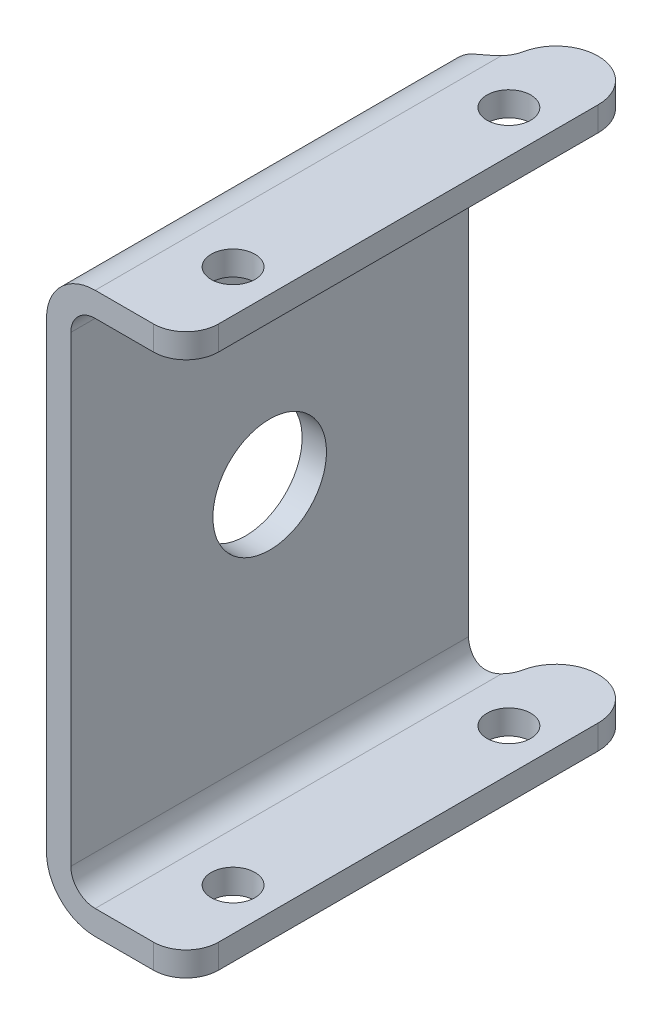
ISO-10303-21;
HEADER;
FILE_DESCRIPTION(('STEP AP214'),'2;1');
FILE_NAME('part.step','',(''),(''),'','','');
FILE_SCHEMA(('AUTOMOTIVE_DESIGN { 1 0 10303 214 1 1 1 1 }'));
ENDSEC;
DATA;
#1=APPLICATION_CONTEXT('core data for automotive mechanical design processes');
#2=APPLICATION_PROTOCOL_DEFINITION('international standard','automotive_design',2000,#1);
#3=PRODUCT_CONTEXT('',#1,'mechanical');
#4=PRODUCT('Part','Part','',(#3));
#5=PRODUCT_RELATED_PRODUCT_CATEGORY('part','',(#4));
#6=PRODUCT_DEFINITION_FORMATION('','',#4);
#7=PRODUCT_DEFINITION_CONTEXT('part definition',#1,'design');
#8=PRODUCT_DEFINITION('design','',#6,#7);
#9=PRODUCT_DEFINITION_SHAPE('','',#8);
#10=(LENGTH_UNIT() NAMED_UNIT(*) SI_UNIT(.MILLI.,.METRE.));
#11=(NAMED_UNIT(*) PLANE_ANGLE_UNIT() SI_UNIT($,.RADIAN.));
#12=(NAMED_UNIT(*) SI_UNIT($,.STERADIAN.) SOLID_ANGLE_UNIT());
#13=UNCERTAINTY_MEASURE_WITH_UNIT(LENGTH_MEASURE(1.E-05),#10,'distance_accuracy_value','');
#14=(GEOMETRIC_REPRESENTATION_CONTEXT(3) GLOBAL_UNCERTAINTY_ASSIGNED_CONTEXT((#13)) GLOBAL_UNIT_ASSIGNED_CONTEXT((#10,
#11,#12)) REPRESENTATION_CONTEXT('',''));
#15=CARTESIAN_POINT('',(0.,0.,0.));
#16=DIRECTION('',(0.,0.,1.));
#17=DIRECTION('',(1.,0.,0.));
#18=AXIS2_PLACEMENT_3D('',#15,#16,#17);
#19=CARTESIAN_POINT('',(8.6,0.,14.));
#20=DIRECTION('',(0.,1.,0.));
#21=DIRECTION('',(-1.,0.,0.));
#22=AXIS2_PLACEMENT_3D('',#19,#20,#21);
#23=PLANE('',#22);
#24=CARTESIAN_POINT('',(5.99999999999998,0.,8.5));
#25=DIRECTION('',(0.,1.,0.));
#26=DIRECTION('',(-1.,0.,0.));
#27=AXIS2_PLACEMENT_3D('',#24,#25,#26);
#28=CIRCLE('',#27,1.35);
#29=CARTESIAN_POINT('',(4.64999999999998,0.,8.5));
#30=VERTEX_POINT('',#29);
#31=EDGE_CURVE('E205',#30,#30,#28,.T.);
#32=ORIENTED_EDGE('',*,*,#31,.T.);
#33=EDGE_LOOP('',(#32));
#34=FACE_BOUND('',#33,.T.);
#35=CARTESIAN_POINT('',(5.99999999999998,0.,-8.5));
#36=DIRECTION('',(0.,1.,0.));
#37=DIRECTION('',(-1.,0.,0.));
#38=AXIS2_PLACEMENT_3D('',#35,#36,#37);
#39=CIRCLE('',#38,1.35);
#40=CARTESIAN_POINT('',(4.64999999999998,0.,-8.5));
#41=VERTEX_POINT('',#40);
#42=EDGE_CURVE('E217',#41,#41,#39,.T.);
#43=ORIENTED_EDGE('',*,*,#42,.T.);
#44=EDGE_LOOP('',(#43));
#45=FACE_BOUND('',#44,.T.);
#46=DIRECTION('',(0.,0.,-1.));
#47=VECTOR('',#46,1.);
#48=CARTESIAN_POINT('',(8.6,0.,14.));
#49=LINE('',#48,#47);
#50=CARTESIAN_POINT('',(8.6,0.,12.));
#51=VERTEX_POINT('',#50);
#52=CARTESIAN_POINT('',(8.6,0.,-11.4));
#53=VERTEX_POINT('',#52);
#54=EDGE_CURVE('E250',#51,#53,#49,.T.);
#55=ORIENTED_EDGE('',*,*,#54,.F.);
#56=CARTESIAN_POINT('',(6.6,0.,12.));
#57=DIRECTION('',(0.,1.,0.));
#58=DIRECTION('',(-1.,0.,0.));
#59=AXIS2_PLACEMENT_3D('',#56,#57,#58);
#60=CIRCLE('',#59,2.);
#61=CARTESIAN_POINT('',(6.6,0.,14.));
#62=VERTEX_POINT('',#61);
#63=EDGE_CURVE('E395',#51,#62,#60,.F.);
#64=ORIENTED_EDGE('',*,*,#63,.T.);
#65=DIRECTION('',(1.,0.,0.));
#66=VECTOR('',#65,1.);
#67=CARTESIAN_POINT('',(8.6,0.,14.));
#68=LINE('',#67,#66);
#69=CARTESIAN_POINT('',(3.,0.,14.));
#70=VERTEX_POINT('',#69);
#71=EDGE_CURVE('E228',#70,#62,#68,.T.);
#72=ORIENTED_EDGE('',*,*,#71,.F.);
#73=DIRECTION('',(0.,0.,-1.));
#74=VECTOR('',#73,1.);
#75=CARTESIAN_POINT('',(3.,0.,14.));
#76=LINE('',#75,#74);
#77=CARTESIAN_POINT('',(3.,0.,-11.0504724351967));
#78=VERTEX_POINT('',#77);
#79=EDGE_CURVE('E164',#70,#78,#76,.T.);
#80=ORIENTED_EDGE('',*,*,#79,.T.);
#81=CARTESIAN_POINT('',(1.74272766597048,0.,-12.2572723340295));
#82=DIRECTION('',(0.,1.,0.));
#83=DIRECTION('',(0.,0.,1.));
#84=AXIS2_PLACEMENT_3D('',#81,#82,#83);
#85=CIRCLE('',#84,1.74272766597048);
#86=CARTESIAN_POINT('',(3.4511622832782,0.,-11.9132507124364));
#87=VERTEX_POINT('',#86);
#88=EDGE_CURVE('E158',#78,#87,#85,.T.);
#89=ORIENTED_EDGE('',*,*,#88,.T.);
#90=CARTESIAN_POINT('',(5.99999999999999,0.,-11.4));
#91=DIRECTION('',(0.,1.,0.));
#92=DIRECTION('',(0.,0.,1.));
#93=AXIS2_PLACEMENT_3D('',#90,#91,#92);
#94=CIRCLE('',#93,2.60000000000001);
#95=EDGE_CURVE('E161',#53,#87,#94,.T.);
#96=ORIENTED_EDGE('',*,*,#95,.F.);
#97=EDGE_LOOP('',(#55,#64,#72,#80,#89,#96));
#98=FACE_BOUND('',#97,.T.);
#99=ADVANCED_FACE('F32',(#34,#45,#98),#23,.F.);
#100=CARTESIAN_POINT('',(1.5,1.5,14.));
#101=DIRECTION('',(0.,-1.,0.));
#102=DIRECTION('',(0.,0.,-1.));
#103=AXIS2_PLACEMENT_3D('',#100,#101,#102);
#104=PLANE('',#103);
#105=CARTESIAN_POINT('',(5.99999999999998,1.5,8.5));
#106=DIRECTION('',(0.,-1.,0.));
#107=DIRECTION('',(0.,0.,-1.));
#108=AXIS2_PLACEMENT_3D('',#105,#106,#107);
#109=CIRCLE('',#108,1.35);
#110=CARTESIAN_POINT('',(5.99999999999998,1.5,7.15));
#111=VERTEX_POINT('',#110);
#112=EDGE_CURVE('E213',#111,#111,#109,.T.);
#113=ORIENTED_EDGE('',*,*,#112,.T.);
#114=EDGE_LOOP('',(#113));
#115=FACE_BOUND('',#114,.T.);
#116=CARTESIAN_POINT('',(5.99999999999998,1.5,-8.5));
#117=DIRECTION('',(0.,-1.,0.));
#118=DIRECTION('',(0.,0.,-1.));
#119=AXIS2_PLACEMENT_3D('',#116,#117,#118);
#120=CIRCLE('',#119,1.35);
#121=CARTESIAN_POINT('',(5.99999999999998,1.5,-9.85));
#122=VERTEX_POINT('',#121);
#123=EDGE_CURVE('E225',#122,#122,#120,.T.);
#124=ORIENTED_EDGE('',*,*,#123,.T.);
#125=EDGE_LOOP('',(#124));
#126=FACE_BOUND('',#125,.T.);
#127=CARTESIAN_POINT('',(1.74272766597048,1.5,-12.2572723340295));
#128=DIRECTION('',(0.,-1.,0.));
#129=DIRECTION('',(0.,0.,-1.));
#130=AXIS2_PLACEMENT_3D('',#127,#128,#129);
#131=CIRCLE('',#130,1.74272766597048);
#132=CARTESIAN_POINT('',(3.4511622832782,1.5,-11.9132507124364));
#133=VERTEX_POINT('',#132);
#134=CARTESIAN_POINT('',(3.,1.5,-11.0504724351967));
#135=VERTEX_POINT('',#134);
#136=EDGE_CURVE('E181',#133,#135,#131,.T.);
#137=ORIENTED_EDGE('',*,*,#136,.T.);
#138=DIRECTION('',(0.,0.,-1.));
#139=VECTOR('',#138,1.);
#140=CARTESIAN_POINT('',(3.,1.5,14.));
#141=LINE('',#140,#139);
#142=CARTESIAN_POINT('',(3.,1.5,14.));
#143=VERTEX_POINT('',#142);
#144=EDGE_CURVE('E375',#135,#143,#141,.F.);
#145=ORIENTED_EDGE('',*,*,#144,.T.);
#146=DIRECTION('',(-1.,0.,0.));
#147=VECTOR('',#146,1.);
#148=CARTESIAN_POINT('',(1.5,1.5,14.));
#149=LINE('',#148,#147);
#150=CARTESIAN_POINT('',(6.6,1.5,14.));
#151=VERTEX_POINT('',#150);
#152=EDGE_CURVE('E231',#151,#143,#149,.T.);
#153=ORIENTED_EDGE('',*,*,#152,.F.);
#154=CARTESIAN_POINT('',(6.6,1.5,12.));
#155=DIRECTION('',(0.,-1.,0.));
#156=DIRECTION('',(0.,0.,-1.));
#157=AXIS2_PLACEMENT_3D('',#154,#155,#156);
#158=CIRCLE('',#157,2.);
#159=CARTESIAN_POINT('',(8.6,1.5,12.));
#160=VERTEX_POINT('',#159);
#161=EDGE_CURVE('E399',#151,#160,#158,.F.);
#162=ORIENTED_EDGE('',*,*,#161,.T.);
#163=DIRECTION('',(0.,0.,-1.));
#164=VECTOR('',#163,1.);
#165=CARTESIAN_POINT('',(8.6,1.5,14.));
#166=LINE('',#165,#164);
#167=CARTESIAN_POINT('',(8.6,1.5,-11.4));
#168=VERTEX_POINT('',#167);
#169=EDGE_CURVE('E248',#160,#168,#166,.T.);
#170=ORIENTED_EDGE('',*,*,#169,.T.);
#171=CARTESIAN_POINT('',(5.99999999999999,1.5,-11.4));
#172=DIRECTION('',(0.,-1.,0.));
#173=DIRECTION('',(0.,0.,-1.));
#174=AXIS2_PLACEMENT_3D('',#171,#172,#173);
#175=CIRCLE('',#174,2.60000000000001);
#176=EDGE_CURVE('E197',#133,#168,#175,.T.);
#177=ORIENTED_EDGE('',*,*,#176,.F.);
#178=EDGE_LOOP('',(#137,#145,#153,#162,#170,#177));
#179=FACE_BOUND('',#178,.T.);
#180=ADVANCED_FACE('F319',(#115,#126,#179),#104,.F.);
#181=CARTESIAN_POINT('',(1.5,33.,14.));
#182=DIRECTION('',(-1.,0.,0.));
#183=DIRECTION('',(0.,-1.,0.));
#184=AXIS2_PLACEMENT_3D('',#181,#182,#183);
#185=PLANE('',#184);
#186=CARTESIAN_POINT('',(1.5,17.25,1.74272766597048));
#187=DIRECTION('',(-1.,0.,0.));
#188=DIRECTION('',(0.,-1.,0.));
#189=AXIS2_PLACEMENT_3D('',#186,#187,#188);
#190=CIRCLE('',#189,3.5);
#191=CARTESIAN_POINT('',(1.5,17.25,5.24272766597048));
#192=VERTEX_POINT('',#191);
#193=EDGE_CURVE('E455',#192,#192,#190,.T.);
#194=ORIENTED_EDGE('',*,*,#193,.T.);
#195=EDGE_LOOP('',(#194));
#196=FACE_BOUND('',#195,.T.);
#197=DIRECTION('',(0.,1.,0.));
#198=VECTOR('',#197,1.);
#199=CARTESIAN_POINT('',(1.5,33.,14.));
#200=LINE('',#199,#198);
#201=CARTESIAN_POINT('',(1.5,3.,14.));
#202=VERTEX_POINT('',#201);
#203=CARTESIAN_POINT('',(1.5,31.5,14.));
#204=VERTEX_POINT('',#203);
#205=EDGE_CURVE('E234',#202,#204,#200,.T.);
#206=ORIENTED_EDGE('',*,*,#205,.F.);
#207=DIRECTION('',(0.,0.,-1.));
#208=VECTOR('',#207,1.);
#209=CARTESIAN_POINT('',(1.5,3.,-10.514544668059));
#210=LINE('',#209,#208);
#211=CARTESIAN_POINT('',(1.5,3.,-10.514544668059));
#212=VERTEX_POINT('',#211);
#213=EDGE_CURVE('E380',#202,#212,#210,.T.);
#214=ORIENTED_EDGE('',*,*,#213,.T.);
#215=DIRECTION('',(0.,-1.,0.));
#216=VECTOR('',#215,1.);
#217=CARTESIAN_POINT('',(1.5,33.,-10.514544668059));
#218=LINE('',#217,#216);
#219=CARTESIAN_POINT('',(1.5,31.5,-10.514544668059));
#220=VERTEX_POINT('',#219);
#221=EDGE_CURVE('E196',#220,#212,#218,.T.);
#222=ORIENTED_EDGE('',*,*,#221,.F.);
#223=DIRECTION('',(0.,0.,-1.));
#224=VECTOR('',#223,1.);
#225=CARTESIAN_POINT('',(1.5,31.5,14.));
#226=LINE('',#225,#224);
#227=EDGE_CURVE('E384',#220,#204,#226,.F.);
#228=ORIENTED_EDGE('',*,*,#227,.T.);
#229=EDGE_LOOP('',(#206,#214,#222,#228));
#230=FACE_BOUND('',#229,.T.);
#231=ADVANCED_FACE('F324',(#196,#230),#185,.F.);
#232=CARTESIAN_POINT('',(8.6,33.,14.));
#233=DIRECTION('',(0.,1.,0.));
#234=DIRECTION('',(0.,0.,1.));
#235=AXIS2_PLACEMENT_3D('',#232,#233,#234);
#236=PLANE('',#235);
#237=CARTESIAN_POINT('',(5.99999999999999,33.,8.5));
#238=DIRECTION('',(0.,1.,0.));
#239=DIRECTION('',(0.,0.,1.));
#240=AXIS2_PLACEMENT_3D('',#237,#238,#239);
#241=CIRCLE('',#240,1.35);
#242=CARTESIAN_POINT('',(5.99999999999999,33.,9.85));
#243=VERTEX_POINT('',#242);
#244=EDGE_CURVE('E208',#243,#243,#241,.T.);
#245=ORIENTED_EDGE('',*,*,#244,.T.);
#246=EDGE_LOOP('',(#245));
#247=FACE_BOUND('',#246,.T.);
#248=CARTESIAN_POINT('',(5.99999999999999,33.,-8.5));
#249=DIRECTION('',(0.,1.,0.));
#250=DIRECTION('',(0.,0.,1.));
#251=AXIS2_PLACEMENT_3D('',#248,#249,#250);
#252=CIRCLE('',#251,1.35);
#253=CARTESIAN_POINT('',(5.99999999999999,33.,-7.15));
#254=VERTEX_POINT('',#253);
#255=EDGE_CURVE('E220',#254,#254,#252,.T.);
#256=ORIENTED_EDGE('',*,*,#255,.T.);
#257=EDGE_LOOP('',(#256));
#258=FACE_BOUND('',#257,.T.);
#259=DIRECTION('',(1.,0.,0.));
#260=VECTOR('',#259,1.);
#261=CARTESIAN_POINT('',(8.6,33.,14.));
#262=LINE('',#261,#260);
#263=CARTESIAN_POINT('',(3.,33.,14.));
#264=VERTEX_POINT('',#263);
#265=CARTESIAN_POINT('',(6.6,33.,14.));
#266=VERTEX_POINT('',#265);
#267=EDGE_CURVE('E237',#264,#266,#262,.T.);
#268=ORIENTED_EDGE('',*,*,#267,.F.);
#269=DIRECTION('',(0.,0.,-1.));
#270=VECTOR('',#269,1.);
#271=CARTESIAN_POINT('',(3.,33.,-10.514544668059));
#272=LINE('',#271,#270);
#273=CARTESIAN_POINT('',(3.,33.,-11.0504724351967));
#274=VERTEX_POINT('',#273);
#275=EDGE_CURVE('E379',#264,#274,#272,.T.);
#276=ORIENTED_EDGE('',*,*,#275,.T.);
#277=CARTESIAN_POINT('',(1.74272766597048,33.,-12.2572723340295));
#278=DIRECTION('',(0.,1.,0.));
#279=DIRECTION('',(0.,0.,1.));
#280=AXIS2_PLACEMENT_3D('',#277,#278,#279);
#281=CIRCLE('',#280,1.74272766597048);
#282=CARTESIAN_POINT('',(3.4511622832782,33.,-11.9132507124364));
#283=VERTEX_POINT('',#282);
#284=EDGE_CURVE('E201',#274,#283,#281,.T.);
#285=ORIENTED_EDGE('',*,*,#284,.T.);
#286=CARTESIAN_POINT('',(5.99999999999999,33.,-11.4));
#287=DIRECTION('',(0.,1.,0.));
#288=DIRECTION('',(0.,0.,1.));
#289=AXIS2_PLACEMENT_3D('',#286,#287,#288);
#290=CIRCLE('',#289,2.60000000000001);
#291=CARTESIAN_POINT('',(8.6,33.,-11.4));
#292=VERTEX_POINT('',#291);
#293=EDGE_CURVE('E193',#292,#283,#290,.T.);
#294=ORIENTED_EDGE('',*,*,#293,.F.);
#295=DIRECTION('',(0.,0.,-1.));
#296=VECTOR('',#295,1.);
#297=CARTESIAN_POINT('',(8.6,33.,14.));
#298=LINE('',#297,#296);
#299=CARTESIAN_POINT('',(8.6,33.,12.));
#300=VERTEX_POINT('',#299);
#301=EDGE_CURVE('E246',#300,#292,#298,.T.);
#302=ORIENTED_EDGE('',*,*,#301,.F.);
#303=CARTESIAN_POINT('',(6.6,33.,12.));
#304=DIRECTION('',(0.,1.,0.));
#305=DIRECTION('',(0.,0.,1.));
#306=AXIS2_PLACEMENT_3D('',#303,#304,#305);
#307=CIRCLE('',#306,2.);
#308=EDGE_CURVE('E388',#300,#266,#307,.F.);
#309=ORIENTED_EDGE('',*,*,#308,.T.);
#310=EDGE_LOOP('',(#268,#276,#285,#294,#302,#309));
#311=FACE_BOUND('',#310,.T.);
#312=ADVANCED_FACE('F337',(#247,#258,#311),#236,.F.);
#313=CARTESIAN_POINT('',(0.,34.5,14.));
#314=DIRECTION('',(0.,-1.,0.));
#315=DIRECTION('',(0.,0.,-1.));
#316=AXIS2_PLACEMENT_3D('',#313,#314,#315);
#317=PLANE('',#316);
#318=CARTESIAN_POINT('',(5.99999999999999,34.5,8.5));
#319=DIRECTION('',(0.,1.,0.));
#320=DIRECTION('',(-1.,0.,0.));
#321=AXIS2_PLACEMENT_3D('',#318,#319,#320);
#322=CIRCLE('',#321,1.35);
#323=CARTESIAN_POINT('',(4.64999999999999,34.5,8.5));
#324=VERTEX_POINT('',#323);
#325=EDGE_CURVE('E204',#324,#324,#322,.T.);
#326=ORIENTED_EDGE('',*,*,#325,.F.);
#327=EDGE_LOOP('',(#326));
#328=FACE_BOUND('',#327,.T.);
#329=CARTESIAN_POINT('',(5.99999999999999,34.5,-8.5));
#330=DIRECTION('',(0.,1.,0.));
#331=DIRECTION('',(-1.,0.,0.));
#332=AXIS2_PLACEMENT_3D('',#329,#330,#331);
#333=CIRCLE('',#332,1.35);
#334=CARTESIAN_POINT('',(4.64999999999999,34.5,-8.5));
#335=VERTEX_POINT('',#334);
#336=EDGE_CURVE('E216',#335,#335,#333,.T.);
#337=ORIENTED_EDGE('',*,*,#336,.F.);
#338=EDGE_LOOP('',(#337));
#339=FACE_BOUND('',#338,.T.);
#340=DIRECTION('',(-1.,0.,0.));
#341=VECTOR('',#340,1.);
#342=CARTESIAN_POINT('',(0.,34.5,14.));
#343=LINE('',#342,#341);
#344=CARTESIAN_POINT('',(6.6,34.5,14.));
#345=VERTEX_POINT('',#344);
#346=CARTESIAN_POINT('',(3.,34.5,14.));
#347=VERTEX_POINT('',#346);
#348=EDGE_CURVE('E239',#345,#347,#343,.T.);
#349=ORIENTED_EDGE('',*,*,#348,.F.);
#350=CARTESIAN_POINT('',(6.6,34.5,12.));
#351=DIRECTION('',(0.,-1.,0.));
#352=DIRECTION('',(0.,0.,-1.));
#353=AXIS2_PLACEMENT_3D('',#350,#351,#352);
#354=CIRCLE('',#353,2.);
#355=CARTESIAN_POINT('',(8.6,34.5,12.));
#356=VERTEX_POINT('',#355);
#357=EDGE_CURVE('E393',#345,#356,#354,.F.);
#358=ORIENTED_EDGE('',*,*,#357,.T.);
#359=DIRECTION('',(0.,0.,-1.));
#360=VECTOR('',#359,1.);
#361=CARTESIAN_POINT('',(8.6,34.5,14.));
#362=LINE('',#361,#360);
#363=CARTESIAN_POINT('',(8.6,34.5,-11.4));
#364=VERTEX_POINT('',#363);
#365=EDGE_CURVE('E244',#356,#364,#362,.T.);
#366=ORIENTED_EDGE('',*,*,#365,.T.);
#367=CARTESIAN_POINT('',(5.99999999999999,34.5,-11.4));
#368=DIRECTION('',(0.,1.,0.));
#369=DIRECTION('',(0.,0.,1.));
#370=AXIS2_PLACEMENT_3D('',#367,#368,#369);
#371=CIRCLE('',#370,2.60000000000001);
#372=CARTESIAN_POINT('',(3.4511622832782,34.5,-11.9132507124364));
#373=VERTEX_POINT('',#372);
#374=EDGE_CURVE('E166',#364,#373,#371,.T.);
#375=ORIENTED_EDGE('',*,*,#374,.T.);
#376=CARTESIAN_POINT('',(1.74272766597048,34.5,-12.2572723340295));
#377=DIRECTION('',(0.,1.,0.));
#378=DIRECTION('',(0.,0.,1.));
#379=AXIS2_PLACEMENT_3D('',#376,#377,#378);
#380=CIRCLE('',#379,1.74272766597048);
#381=CARTESIAN_POINT('',(3.,34.5,-11.0504724351967));
#382=VERTEX_POINT('',#381);
#383=EDGE_CURVE('E444',#382,#373,#380,.T.);
#384=ORIENTED_EDGE('',*,*,#383,.F.);
#385=DIRECTION('',(0.,0.,-1.));
#386=VECTOR('',#385,1.);
#387=CARTESIAN_POINT('',(3.,34.5,14.));
#388=LINE('',#387,#386);
#389=EDGE_CURVE('E406',#382,#347,#388,.F.);
#390=ORIENTED_EDGE('',*,*,#389,.T.);
#391=EDGE_LOOP('',(#349,#358,#366,#375,#384,#390));
#392=FACE_BOUND('',#391,.T.);
#393=ADVANCED_FACE('F341',(#328,#339,#392),#317,.F.);
#394=CARTESIAN_POINT('',(0.,0.,14.));
#395=DIRECTION('',(1.,0.,0.));
#396=DIRECTION('',(0.,0.,-1.));
#397=AXIS2_PLACEMENT_3D('',#394,#395,#396);
#398=PLANE('',#397);
#399=CARTESIAN_POINT('',(0.,17.25,1.74272766597048));
#400=DIRECTION('',(-1.,0.,0.));
#401=DIRECTION('',(0.,0.,1.));
#402=AXIS2_PLACEMENT_3D('',#399,#400,#401);
#403=CIRCLE('',#402,3.5);
#404=CARTESIAN_POINT('',(0.,17.25,5.24272766597048));
#405=VERTEX_POINT('',#404);
#406=EDGE_CURVE('E460',#405,#405,#403,.T.);
#407=ORIENTED_EDGE('',*,*,#406,.F.);
#408=EDGE_LOOP('',(#407));
#409=FACE_BOUND('',#408,.T.);
#410=DIRECTION('',(0.,1.,0.));
#411=VECTOR('',#410,1.);
#412=CARTESIAN_POINT('',(0.,0.,-10.514544668059));
#413=LINE('',#412,#411);
#414=CARTESIAN_POINT('',(0.,3.,-10.514544668059));
#415=VERTEX_POINT('',#414);
#416=CARTESIAN_POINT('',(0.,31.5,-10.514544668059));
#417=VERTEX_POINT('',#416);
#418=EDGE_CURVE('E177',#415,#417,#413,.T.);
#419=ORIENTED_EDGE('',*,*,#418,.F.);
#420=DIRECTION('',(0.,0.,-1.));
#421=VECTOR('',#420,1.);
#422=CARTESIAN_POINT('',(0.,3.,14.));
#423=LINE('',#422,#421);
#424=CARTESIAN_POINT('',(0.,3.,14.));
#425=VERTEX_POINT('',#424);
#426=EDGE_CURVE('E417',#415,#425,#423,.F.);
#427=ORIENTED_EDGE('',*,*,#426,.T.);
#428=DIRECTION('',(0.,-1.,0.));
#429=VECTOR('',#428,1.);
#430=CARTESIAN_POINT('',(0.,0.,14.));
#431=LINE('',#430,#429);
#432=CARTESIAN_POINT('',(0.,31.5,14.));
#433=VERTEX_POINT('',#432);
#434=EDGE_CURVE('E241',#433,#425,#431,.T.);
#435=ORIENTED_EDGE('',*,*,#434,.F.);
#436=DIRECTION('',(0.,0.,-1.));
#437=VECTOR('',#436,1.);
#438=CARTESIAN_POINT('',(0.,31.5,14.));
#439=LINE('',#438,#437);
#440=EDGE_CURVE('E421',#433,#417,#439,.T.);
#441=ORIENTED_EDGE('',*,*,#440,.T.);
#442=EDGE_LOOP('',(#419,#427,#435,#441));
#443=FACE_BOUND('',#442,.T.);
#444=ADVANCED_FACE('F332',(#409,#443),#398,.F.);
#445=CARTESIAN_POINT('',(8.6,1.5,14.));
#446=DIRECTION('',(-1.,0.,0.));
#447=DIRECTION('',(0.,0.,1.));
#448=AXIS2_PLACEMENT_3D('',#445,#446,#447);
#449=PLANE('',#448);
#450=ORIENTED_EDGE('',*,*,#169,.F.);
#451=DIRECTION('',(0.,1.,0.));
#452=VECTOR('',#451,1.);
#453=CARTESIAN_POINT('',(8.6,1.5,12.));
#454=LINE('',#453,#452);
#455=EDGE_CURVE('E397',#160,#51,#454,.F.);
#456=ORIENTED_EDGE('',*,*,#455,.T.);
#457=ORIENTED_EDGE('',*,*,#54,.T.);
#458=DIRECTION('',(0.,1.,0.));
#459=VECTOR('',#458,1.);
#460=CARTESIAN_POINT('',(8.6,0.,-11.4));
#461=LINE('',#460,#459);
#462=EDGE_CURVE('E176',#53,#168,#461,.T.);
#463=ORIENTED_EDGE('',*,*,#462,.T.);
#464=EDGE_LOOP('',(#450,#456,#457,#463));
#465=FACE_BOUND('',#464,.T.);
#466=ADVANCED_FACE('F329',(#465),#449,.F.);
#467=CARTESIAN_POINT('',(8.6,34.5,14.));
#468=DIRECTION('',(-1.,0.,0.));
#469=DIRECTION('',(0.,-1.,0.));
#470=AXIS2_PLACEMENT_3D('',#467,#468,#469);
#471=PLANE('',#470);
#472=ORIENTED_EDGE('',*,*,#365,.F.);
#473=DIRECTION('',(0.,1.,0.));
#474=VECTOR('',#473,1.);
#475=CARTESIAN_POINT('',(8.6,34.5,12.));
#476=LINE('',#475,#474);
#477=EDGE_CURVE('E391',#356,#300,#476,.F.);
#478=ORIENTED_EDGE('',*,*,#477,.T.);
#479=ORIENTED_EDGE('',*,*,#301,.T.);
#480=EDGE_CURVE('E182',#292,#364,#461,.T.);
#481=ORIENTED_EDGE('',*,*,#480,.T.);
#482=EDGE_LOOP('',(#472,#478,#479,#481));
#483=FACE_BOUND('',#482,.T.);
#484=ADVANCED_FACE('F331',(#483),#471,.F.);
#485=CARTESIAN_POINT('',(0.,0.,14.));
#486=DIRECTION('',(0.,0.,-1.));
#487=DIRECTION('',(-1.,0.,0.));
#488=AXIS2_PLACEMENT_3D('',#485,#486,#487);
#489=PLANE('',#488);
#490=ORIENTED_EDGE('',*,*,#71,.T.);
#491=DIRECTION('',(0.,1.,0.));
#492=VECTOR('',#491,1.);
#493=CARTESIAN_POINT('',(6.6,0.,14.));
#494=LINE('',#493,#492);
#495=EDGE_CURVE('E401',#62,#151,#494,.T.);
#496=ORIENTED_EDGE('',*,*,#495,.T.);
#497=ORIENTED_EDGE('',*,*,#152,.T.);
#498=CARTESIAN_POINT('',(3.,3.,14.));
#499=DIRECTION('',(0.,0.,-1.));
#500=DIRECTION('',(-1.,0.,0.));
#501=AXIS2_PLACEMENT_3D('',#498,#499,#500);
#502=CIRCLE('',#501,1.5);
#503=EDGE_CURVE('E293',#143,#202,#502,.T.);
#504=ORIENTED_EDGE('',*,*,#503,.T.);
#505=ORIENTED_EDGE('',*,*,#205,.T.);
#506=CARTESIAN_POINT('',(3.,31.5,14.));
#507=DIRECTION('',(0.,0.,-1.));
#508=DIRECTION('',(-1.,0.,0.));
#509=AXIS2_PLACEMENT_3D('',#506,#507,#508);
#510=CIRCLE('',#509,1.5);
#511=EDGE_CURVE('E11',#204,#264,#510,.T.);
#512=ORIENTED_EDGE('',*,*,#511,.T.);
#513=ORIENTED_EDGE('',*,*,#267,.T.);
#514=DIRECTION('',(0.,1.,0.));
#515=VECTOR('',#514,1.);
#516=CARTESIAN_POINT('',(6.60000000000004,0.,14.));
#517=LINE('',#516,#515);
#518=EDGE_CURVE('E404',#266,#345,#517,.T.);
#519=ORIENTED_EDGE('',*,*,#518,.T.);
#520=ORIENTED_EDGE('',*,*,#348,.T.);
#521=CARTESIAN_POINT('',(3.,31.5,14.));
#522=DIRECTION('',(0.,0.,-1.));
#523=DIRECTION('',(-1.,0.,0.));
#524=AXIS2_PLACEMENT_3D('',#521,#522,#523);
#525=CIRCLE('',#524,3.);
#526=EDGE_CURVE('E415',#347,#433,#525,.F.);
#527=ORIENTED_EDGE('',*,*,#526,.T.);
#528=ORIENTED_EDGE('',*,*,#434,.T.);
#529=CARTESIAN_POINT('',(3.,3.,14.));
#530=DIRECTION('',(0.,0.,-1.));
#531=DIRECTION('',(-1.,0.,0.));
#532=AXIS2_PLACEMENT_3D('',#529,#530,#531);
#533=CIRCLE('',#532,3.);
#534=EDGE_CURVE('E412',#425,#70,#533,.F.);
#535=ORIENTED_EDGE('',*,*,#534,.T.);
#536=EDGE_LOOP('',(#490,#496,#497,#504,#505,#512,#513,#519,#520,#527,#528,#535));
#537=FACE_BOUND('',#536,.T.);
#538=ADVANCED_FACE('F345',(#537),#489,.F.);
#539=CARTESIAN_POINT('',(5.99999999999998,0.,-8.5));
#540=DIRECTION('',(0.,1.,0.));
#541=DIRECTION('',(-1.,0.,0.));
#542=AXIS2_PLACEMENT_3D('',#539,#540,#541);
#543=CYLINDRICAL_SURFACE('',#542,1.35);
#544=ORIENTED_EDGE('',*,*,#336,.T.);
#545=EDGE_LOOP('',(#544));
#546=FACE_BOUND('',#545,.T.);
#547=ORIENTED_EDGE('',*,*,#255,.F.);
#548=EDGE_LOOP('',(#547));
#549=FACE_BOUND('',#548,.T.);
#550=ADVANCED_FACE('F355',(#546,#549),#543,.F.);
#551=ORIENTED_EDGE('',*,*,#42,.F.);
#552=EDGE_LOOP('',(#551));
#553=FACE_BOUND('',#552,.T.);
#554=ORIENTED_EDGE('',*,*,#123,.F.);
#555=EDGE_LOOP('',(#554));
#556=FACE_BOUND('',#555,.T.);
#557=ADVANCED_FACE('F357',(#553,#556),#543,.F.);
#558=CARTESIAN_POINT('',(5.99999999999998,0.,8.5));
#559=DIRECTION('',(0.,1.,0.));
#560=DIRECTION('',(-1.,0.,0.));
#561=AXIS2_PLACEMENT_3D('',#558,#559,#560);
#562=CYLINDRICAL_SURFACE('',#561,1.35);
#563=ORIENTED_EDGE('',*,*,#325,.T.);
#564=EDGE_LOOP('',(#563));
#565=FACE_BOUND('',#564,.T.);
#566=ORIENTED_EDGE('',*,*,#244,.F.);
#567=EDGE_LOOP('',(#566));
#568=FACE_BOUND('',#567,.T.);
#569=ADVANCED_FACE('F359',(#565,#568),#562,.F.);
#570=ORIENTED_EDGE('',*,*,#31,.F.);
#571=EDGE_LOOP('',(#570));
#572=FACE_BOUND('',#571,.T.);
#573=ORIENTED_EDGE('',*,*,#112,.F.);
#574=EDGE_LOOP('',(#573));
#575=FACE_BOUND('',#574,.T.);
#576=ADVANCED_FACE('F271',(#572,#575),#562,.F.);
#577=CARTESIAN_POINT('',(1.74272766597048,0.,-12.2572723340295));
#578=DIRECTION('',(0.,1.,0.));
#579=DIRECTION('',(0.,0.,1.));
#580=AXIS2_PLACEMENT_3D('',#577,#578,#579);
#581=CYLINDRICAL_SURFACE('',#580,1.74272766597048);
#582=ORIENTED_EDGE('',*,*,#88,.F.);
#583=CARTESIAN_POINT('',(3.,0.,-11.0504724351967));
#584=CARTESIAN_POINT('',(2.9688787187891,6.91416148309706E-07,-11.0180492769909));
#585=CARTESIAN_POINT('',(2.93651334847742,0.000485023764181156,-10.9868433162632));
#586=CARTESIAN_POINT('',(2.86948448453418,0.00265219925928852,-10.9270319430946));
#587=CARTESIAN_POINT('',(2.83482031781807,0.00433539484960169,-10.8984272981809));
#588=CARTESIAN_POINT('',(2.72785620677366,0.0115190727399656,-10.8169163014676));
#589=CARTESIAN_POINT('',(2.65244098789537,0.0191515570614734,-10.7681635629282));
#590=CARTESIAN_POINT('',(2.49565473659518,0.0416347616338281,-10.6830453544342));
#591=CARTESIAN_POINT('',(2.41426716377574,0.0565062242213348,-10.6467159944254));
#592=CARTESIAN_POINT('',(2.24864157386747,0.0943752964145781,-10.5872795780509));
#593=CARTESIAN_POINT('',(2.16440577959743,0.117366695609853,-10.5641624517896));
#594=CARTESIAN_POINT('',(2.0234050587416,0.16277509103551,-10.5363150495524));
#595=CARTESIAN_POINT('',(1.96657695846804,0.182967475524568,-10.5280548510003));
#596=CARTESIAN_POINT('',(1.85381015270247,0.226926298617662,-10.5171642971198));
#597=CARTESIAN_POINT('',(1.79787086325418,0.250690273367672,-10.5145300796276));
#598=CARTESIAN_POINT('',(1.74272766597048,0.27616698784893,-10.514544668059));
#599=B_SPLINE_CURVE_WITH_KNOTS('',3,(#583,#584,#585,#586,#587,#588,#589,#590,#591,#592,#593,
#594,#595,#596,#597,#598),.UNSPECIFIED.,.F.,.F.,(4,2,2,2,2,2,2,4),(0.,0.134754041165969,
0.269547713844626,0.538520974033519,0.808269519217768,1.07781219652253,1.26007625699713,
1.44221515526337),.UNSPECIFIED.);
#600=CARTESIAN_POINT('',(1.74272766597048,0.276166987848929,-10.514544668059));
#601=VERTEX_POINT('',#600);
#602=EDGE_CURVE('E253',#78,#601,#599,.T.);
#603=ORIENTED_EDGE('',*,*,#602,.T.);
#604=DIRECTION('',(0.,1.,0.));
#605=VECTOR('',#604,1.);
#606=CARTESIAN_POINT('',(1.74272766597048,0.,-10.514544668059));
#607=LINE('',#606,#605);
#608=CARTESIAN_POINT('',(1.74272766597048,2.18191303757821,-10.514544668059));
#609=VERTEX_POINT('',#608);
#610=EDGE_CURVE('E56',#601,#609,#607,.T.);
#611=ORIENTED_EDGE('',*,*,#610,.T.);
#612=CARTESIAN_POINT('',(1.74272766597048,2.18191303757821,-10.514544668059));
#613=CARTESIAN_POINT('',(1.76298829210795,2.1507758138543,-10.5145473788327));
#614=CARTESIAN_POINT('',(1.78439980200899,2.12040211163332,-10.5148983547346));
#615=CARTESIAN_POINT('',(1.8294125753794,2.06132710761213,-10.516555251127));
#616=CARTESIAN_POINT('',(1.85301497171984,2.03262668366445,-10.5178616680889));
#617=CARTESIAN_POINT('',(1.92704482265516,1.94914545639582,-10.5236124823164));
#618=CARTESIAN_POINT('',(1.98057997806781,1.89716113702714,-10.5298913451087));
#619=CARTESIAN_POINT('',(2.09426900671771,1.8020142995632,-10.5493929257462));
#620=CARTESIAN_POINT('',(2.15444927659781,1.75888906397996,-10.5626441861418));
#621=CARTESIAN_POINT('',(2.27847247656959,1.68293465765398,-10.5976932163645));
#622=CARTESIAN_POINT('',(2.34230327488232,1.65007348901153,-10.6194639390504));
#623=CARTESIAN_POINT('',(2.46600666040007,1.59676505525846,-10.6704135436866));
#624=CARTESIAN_POINT('',(2.52583619882532,1.57559857608266,-10.6989519704888));
#625=CARTESIAN_POINT('',(2.64368462897995,1.5416415711589,-10.7639829111559));
#626=CARTESIAN_POINT('',(2.70169921676566,1.52886970127736,-10.8004929026443));
#627=CARTESIAN_POINT('',(2.80101082695989,1.51260660959822,-10.8716372390547));
#628=CARTESIAN_POINT('',(2.8431257955518,1.50767138172774,-10.9048352088758));
#629=CARTESIAN_POINT('',(2.92409527896673,1.50137325489583,-10.9749525717773));
#630=CARTESIAN_POINT('',(2.9629637990641,1.4999941523917,-11.0118542862152));
#631=CARTESIAN_POINT('',(3.,1.5,-11.0504724351967));
#632=B_SPLINE_CURVE_WITH_KNOTS('',3,(#612,#613,#614,#615,#616,#617,#618,#619,#620,#621,#622,
#623,#624,#625,#626,#627,#628,#629,#630,#631),.UNSPECIFIED.,.F.,.F.,(4,2,2,2,2,2,2,2,2,4),(0.,
0.11139096488834,0.222839852507379,0.446362251206411,0.670806873973574,0.894544648303915,
1.10229635019287,1.31050820449151,1.47172847275254,1.63221282956227),.UNSPECIFIED.);
#633=EDGE_CURVE('E287',#609,#135,#632,.T.);
#634=ORIENTED_EDGE('',*,*,#633,.T.);
#635=ORIENTED_EDGE('',*,*,#136,.F.);
#636=DIRECTION('',(0.,1.,0.));
#637=VECTOR('',#636,1.);
#638=CARTESIAN_POINT('',(3.4511622832782,0.,-11.9132507124364));
#639=LINE('',#638,#637);
#640=EDGE_CURVE('E173',#87,#133,#639,.T.);
#641=ORIENTED_EDGE('',*,*,#640,.F.);
#642=EDGE_LOOP('',(#582,#603,#611,#634,#635,#641));
#643=FACE_BOUND('',#642,.T.);
#644=ADVANCED_FACE('F179',(#643),#581,.F.);
#645=CARTESIAN_POINT('',(1.74272766597048,32.3180869624218,-10.514544668059));
#646=VERTEX_POINT('',#645);
#647=CARTESIAN_POINT('',(1.74272766597048,34.2238330121511,-10.514544668059));
#648=VERTEX_POINT('',#647);
#649=EDGE_CURVE('E48',#646,#648,#607,.T.);
#650=ORIENTED_EDGE('',*,*,#649,.T.);
#651=CARTESIAN_POINT('',(1.74272766597048,34.2238330121511,-10.514544668059));
#652=CARTESIAN_POINT('',(1.78349832377673,34.2426602107489,-10.5145390613783));
#653=CARTESIAN_POINT('',(1.82470583427658,34.2605622000381,-10.5159755845987));
#654=CARTESIAN_POINT('',(1.90770987365457,34.2944410825309,-10.5218738937375));
#655=CARTESIAN_POINT('',(1.94950663646017,34.3104171856824,-10.5263369162699));
#656=CARTESIAN_POINT('',(2.03329755365517,34.3403279922683,-10.5384189189678));
#657=CARTESIAN_POINT('',(2.07529123683516,34.3542662063404,-10.5460323831205));
#658=CARTESIAN_POINT('',(2.15917823228876,34.380095305025,-10.5644886815923));
#659=CARTESIAN_POINT('',(2.2010715615545,34.391986564567,-10.5753309235186));
#660=CARTESIAN_POINT('',(2.32634073390548,34.4246555929565,-10.612862565529));
#661=CARTESIAN_POINT('',(2.40910585531809,34.4423582844557,-10.6445291858603));
#662=CARTESIAN_POINT('',(2.56976652070454,34.470111449308,-10.720713274298));
#663=CARTESIAN_POINT('',(2.64766491822011,34.4801664461833,-10.7652231242578));
#664=CARTESIAN_POINT('',(2.77203720679582,34.4917530878799,-10.8496805990802));
#665=CARTESIAN_POINT('',(2.82054101463378,34.4949880087679,-10.8864669472757));
#666=CARTESIAN_POINT('',(2.91346610673433,34.4991130730569,-10.9649191254634));
#667=CARTESIAN_POINT('',(2.95789097867959,34.5000052964493,-11.0065805926649));
#668=CARTESIAN_POINT('',(3.,34.5,-11.0504724351967));
#669=B_SPLINE_CURVE_WITH_KNOTS('',3,(#651,#652,#653,#654,#655,#656,#657,#658,#659,#660,#661,
#662,#663,#664,#665,#666,#667,#668),.UNSPECIFIED.,.F.,.F.,(4,2,2,2,2,2,2,2,4),(0.,
0.134701121168985,0.269457313794135,0.403978557545724,0.538475135493665,0.808100901963509,
1.07756706364912,1.26009366367551,1.4424581504343),.UNSPECIFIED.);
#670=EDGE_CURVE('E280',#648,#382,#669,.T.);
#671=ORIENTED_EDGE('',*,*,#670,.T.);
#672=ORIENTED_EDGE('',*,*,#383,.T.);
#673=EDGE_CURVE('E183',#283,#373,#639,.T.);
#674=ORIENTED_EDGE('',*,*,#673,.F.);
#675=ORIENTED_EDGE('',*,*,#284,.F.);
#676=CARTESIAN_POINT('',(3.,33.,-11.0504724351967));
#677=CARTESIAN_POINT('',(2.97434615600977,32.999998451127,-11.0237444534494));
#678=CARTESIAN_POINT('',(2.94784342528352,32.9993409278739,-10.9978424644549));
#679=CARTESIAN_POINT('',(2.893271652715,32.9964487160786,-10.9477985395569));
#680=CARTESIAN_POINT('',(2.86520143156352,32.994212824911,-10.9236579612322));
#681=CARTESIAN_POINT('',(2.77876834997634,32.9847261529408,-10.8539957440036));
#682=CARTESIAN_POINT('',(2.71830003590918,32.9746939733425,-10.8113552462446));
#683=CARTESIAN_POINT('',(2.59374758330575,32.9453610912601,-10.7346949127425));
#684=CARTESIAN_POINT('',(2.52964626509158,32.9260124255146,-10.7007210952371));
#685=CARTESIAN_POINT('',(2.40127396575724,32.8770338727972,-10.6422261586283));
#686=CARTESIAN_POINT('',(2.33700404158992,32.8474344573432,-10.6176774732783));
#687=CARTESIAN_POINT('',(2.21626504797865,32.7806826597088,-10.5790069254971));
#688=CARTESIAN_POINT('',(2.15957857064092,32.7442997134809,-10.5642210049145));
#689=CARTESIAN_POINT('',(2.05072676734873,32.6633948337536,-10.5410728127202));
#690=CARTESIAN_POINT('',(1.99857105111697,32.6188561949375,-10.5327239123855));
#691=CARTESIAN_POINT('',(1.91067396350459,32.5326407212545,-10.5222109809758));
#692=CARTESIAN_POINT('',(1.87375968889806,32.4922495522785,-10.5191298067606));
#693=CARTESIAN_POINT('',(1.80464306573562,32.4077994390577,-10.5153041969104));
#694=CARTESIAN_POINT('',(1.77242136325433,32.3637568078669,-10.514549888415));
#695=CARTESIAN_POINT('',(1.74272766597062,32.3180869624217,-10.514544668059));
#696=B_SPLINE_CURVE_WITH_KNOTS('',3,(#676,#677,#678,#679,#680,#681,#682,#683,#684,#685,#686,
#687,#688,#689,#690,#691,#692,#693,#694,#695),.UNSPECIFIED.,.F.,.F.,(4,2,2,2,2,2,2,2,2,4),(0.,
0.111095556677276,0.222275853264536,0.445137102663071,0.669158159840032,0.892518925258726,
1.09845348228993,1.30481467213996,1.46886378640866,1.63221587829824),.UNSPECIFIED.);
#697=EDGE_CURVE('E428',#274,#646,#696,.T.);
#698=ORIENTED_EDGE('',*,*,#697,.T.);
#699=EDGE_LOOP('',(#650,#671,#672,#674,#675,#698));
#700=FACE_BOUND('',#699,.T.);
#701=ADVANCED_FACE('F270',(#700),#581,.F.);
#702=CARTESIAN_POINT('',(0.,0.,-10.514544668059));
#703=DIRECTION('',(0.,0.,-1.));
#704=DIRECTION('',(-1.,0.,0.));
#705=AXIS2_PLACEMENT_3D('',#702,#703,#704);
#706=PLANE('',#705);
#707=ORIENTED_EDGE('',*,*,#610,.F.);
#708=CARTESIAN_POINT('',(3.,3.,-10.514544668059));
#709=DIRECTION('',(0.,0.,-1.));
#710=DIRECTION('',(-1.,0.,0.));
#711=AXIS2_PLACEMENT_3D('',#708,#709,#710);
#712=CIRCLE('',#711,3.);
#713=EDGE_CURVE('E423',#601,#415,#712,.T.);
#714=ORIENTED_EDGE('',*,*,#713,.T.);
#715=ORIENTED_EDGE('',*,*,#418,.T.);
#716=CARTESIAN_POINT('',(3.,31.5,-10.514544668059));
#717=DIRECTION('',(0.,0.,-1.));
#718=DIRECTION('',(-1.,0.,0.));
#719=AXIS2_PLACEMENT_3D('',#716,#717,#718);
#720=CIRCLE('',#719,3.);
#721=EDGE_CURVE('E260',#417,#648,#720,.T.);
#722=ORIENTED_EDGE('',*,*,#721,.T.);
#723=ORIENTED_EDGE('',*,*,#649,.F.);
#724=CARTESIAN_POINT('',(3.,31.5,-10.514544668059));
#725=DIRECTION('',(0.,0.,-1.));
#726=DIRECTION('',(-1.,0.,0.));
#727=AXIS2_PLACEMENT_3D('',#724,#725,#726);
#728=CIRCLE('',#727,1.5);
#729=EDGE_CURVE('E41',#646,#220,#728,.F.);
#730=ORIENTED_EDGE('',*,*,#729,.T.);
#731=ORIENTED_EDGE('',*,*,#221,.T.);
#732=CARTESIAN_POINT('',(3.,3.,-10.514544668059));
#733=DIRECTION('',(0.,0.,-1.));
#734=DIRECTION('',(-1.,0.,0.));
#735=AXIS2_PLACEMENT_3D('',#732,#733,#734);
#736=CIRCLE('',#735,1.5);
#737=EDGE_CURVE('E294',#212,#609,#736,.F.);
#738=ORIENTED_EDGE('',*,*,#737,.T.);
#739=EDGE_LOOP('',(#707,#714,#715,#722,#723,#730,#731,#738));
#740=FACE_BOUND('',#739,.T.);
#741=ADVANCED_FACE('F273',(#740),#706,.T.);
#742=CARTESIAN_POINT('',(5.99999999999999,0.,-11.4));
#743=DIRECTION('',(0.,1.,0.));
#744=DIRECTION('',(0.,0.,1.));
#745=AXIS2_PLACEMENT_3D('',#742,#743,#744);
#746=CYLINDRICAL_SURFACE('',#745,2.60000000000001);
#747=ORIENTED_EDGE('',*,*,#176,.T.);
#748=ORIENTED_EDGE('',*,*,#462,.F.);
#749=ORIENTED_EDGE('',*,*,#95,.T.);
#750=ORIENTED_EDGE('',*,*,#640,.T.);
#751=EDGE_LOOP('',(#747,#748,#749,#750));
#752=FACE_BOUND('',#751,.T.);
#753=ADVANCED_FACE('F172',(#752),#746,.T.);
#754=ORIENTED_EDGE('',*,*,#293,.T.);
#755=ORIENTED_EDGE('',*,*,#673,.T.);
#756=ORIENTED_EDGE('',*,*,#374,.F.);
#757=ORIENTED_EDGE('',*,*,#480,.F.);
#758=EDGE_LOOP('',(#754,#755,#756,#757));
#759=FACE_BOUND('',#758,.T.);
#760=ADVANCED_FACE('F448',(#759),#746,.T.);
#761=CARTESIAN_POINT('',(8.6,17.25,1.74272766597048));
#762=DIRECTION('',(-1.,0.,0.));
#763=DIRECTION('',(0.,0.,1.));
#764=AXIS2_PLACEMENT_3D('',#761,#762,#763);
#765=CYLINDRICAL_SURFACE('',#764,3.5);
#766=CARTESIAN_POINT('',(0.,17.25,5.24272766597048));
#767=CARTESIAN_POINT('',(0.0156250000000017,17.25,5.24272766597048));
#768=CARTESIAN_POINT('',(0.0312500000000018,17.25,5.24272766597048));
#769=CARTESIAN_POINT('',(0.0625000000000018,17.25,5.24272766597048));
#770=CARTESIAN_POINT('',(0.0781250000000018,17.25,5.24272766597048));
#771=CARTESIAN_POINT('',(0.109375000000002,17.25,5.24272766597048));
#772=CARTESIAN_POINT('',(0.125000000000002,17.25,5.24272766597048));
#773=CARTESIAN_POINT('',(0.156250000000002,17.25,5.24272766597048));
#774=CARTESIAN_POINT('',(0.171875000000002,17.25,5.24272766597048));
#775=CARTESIAN_POINT('',(0.203125000000002,17.25,5.24272766597048));
#776=CARTESIAN_POINT('',(0.218750000000002,17.25,5.24272766597048));
#777=CARTESIAN_POINT('',(0.250000000000002,17.25,5.24272766597048));
#778=CARTESIAN_POINT('',(0.265625000000002,17.25,5.24272766597048));
#779=CARTESIAN_POINT('',(0.296875000000002,17.25,5.24272766597048));
#780=CARTESIAN_POINT('',(0.312500000000002,17.25,5.24272766597048));
#781=CARTESIAN_POINT('',(0.343750000000002,17.25,5.24272766597048));
#782=CARTESIAN_POINT('',(0.359375000000002,17.25,5.24272766597048));
#783=CARTESIAN_POINT('',(0.390625000000002,17.25,5.24272766597048));
#784=CARTESIAN_POINT('',(0.406250000000002,17.25,5.24272766597048));
#785=CARTESIAN_POINT('',(0.437500000000002,17.25,5.24272766597048));
#786=CARTESIAN_POINT('',(0.453125000000002,17.25,5.24272766597048));
#787=CARTESIAN_POINT('',(0.484375000000002,17.25,5.24272766597048));
#788=CARTESIAN_POINT('',(0.500000000000002,17.25,5.24272766597048));
#789=CARTESIAN_POINT('',(0.531250000000002,17.25,5.24272766597048));
#790=CARTESIAN_POINT('',(0.546875000000002,17.25,5.24272766597048));
#791=CARTESIAN_POINT('',(0.578125000000002,17.25,5.24272766597048));
#792=CARTESIAN_POINT('',(0.593750000000002,17.25,5.24272766597048));
#793=CARTESIAN_POINT('',(0.625000000000002,17.25,5.24272766597048));
#794=CARTESIAN_POINT('',(0.640625000000002,17.25,5.24272766597048));
#795=CARTESIAN_POINT('',(0.671875000000002,17.25,5.24272766597048));
#796=CARTESIAN_POINT('',(0.687500000000001,17.25,5.24272766597048));
#797=CARTESIAN_POINT('',(0.718750000000001,17.25,5.24272766597048));
#798=CARTESIAN_POINT('',(0.734375000000002,17.25,5.24272766597048));
#799=CARTESIAN_POINT('',(0.765625000000002,17.25,5.24272766597048));
#800=CARTESIAN_POINT('',(0.781250000000001,17.25,5.24272766597048));
#801=CARTESIAN_POINT('',(0.812500000000001,17.25,5.24272766597048));
#802=CARTESIAN_POINT('',(0.828125000000001,17.25,5.24272766597048));
#803=CARTESIAN_POINT('',(0.859375000000001,17.25,5.24272766597048));
#804=CARTESIAN_POINT('',(0.875000000000001,17.25,5.24272766597048));
#805=CARTESIAN_POINT('',(0.906250000000001,17.25,5.24272766597048));
#806=CARTESIAN_POINT('',(0.921875000000001,17.25,5.24272766597048));
#807=CARTESIAN_POINT('',(0.953125000000001,17.25,5.24272766597048));
#808=CARTESIAN_POINT('',(0.968750000000001,17.25,5.24272766597048));
#809=CARTESIAN_POINT('',(1.,17.25,5.24272766597048));
#810=CARTESIAN_POINT('',(1.015625,17.25,5.24272766597048));
#811=CARTESIAN_POINT('',(1.046875,17.25,5.24272766597048));
#812=CARTESIAN_POINT('',(1.0625,17.25,5.24272766597048));
#813=CARTESIAN_POINT('',(1.09375,17.25,5.24272766597048));
#814=CARTESIAN_POINT('',(1.109375,17.25,5.24272766597048));
#815=CARTESIAN_POINT('',(1.140625,17.25,5.24272766597048));
#816=CARTESIAN_POINT('',(1.15625,17.25,5.24272766597048));
#817=CARTESIAN_POINT('',(1.1875,17.25,5.24272766597048));
#818=CARTESIAN_POINT('',(1.203125,17.25,5.24272766597048));
#819=CARTESIAN_POINT('',(1.234375,17.25,5.24272766597048));
#820=CARTESIAN_POINT('',(1.25,17.25,5.24272766597048));
#821=CARTESIAN_POINT('',(1.28125,17.25,5.24272766597048));
#822=CARTESIAN_POINT('',(1.296875,17.25,5.24272766597048));
#823=CARTESIAN_POINT('',(1.328125,17.25,5.24272766597048));
#824=CARTESIAN_POINT('',(1.34375,17.25,5.24272766597048));
#825=CARTESIAN_POINT('',(1.375,17.25,5.24272766597048));
#826=CARTESIAN_POINT('',(1.390625,17.25,5.24272766597048));
#827=CARTESIAN_POINT('',(1.421875,17.25,5.24272766597048));
#828=CARTESIAN_POINT('',(1.4375,17.25,5.24272766597048));
#829=CARTESIAN_POINT('',(1.46875,17.25,5.24272766597048));
#830=CARTESIAN_POINT('',(1.484375,17.25,5.24272766597048));
#831=CARTESIAN_POINT('',(1.5,17.25,5.24272766597048));
#832=B_SPLINE_CURVE_WITH_KNOTS('',3,(#766,#767,#768,#769,#770,#771,#772,#773,#774,#775,#776,
#777,#778,#779,#780,#781,#782,#783,#784,#785,#786,#787,#788,#789,#790,#791,#792,#793,#794,#795,
#796,#797,#798,#799,#800,#801,#802,#803,#804,#805,#806,#807,#808,#809,#810,#811,#812,#813,#814,
#815,#816,#817,#818,#819,#820,#821,#822,#823,#824,#825,#826,#827,#828,#829,#830,#831),
.UNSPECIFIED.,.F.,.F.,(4,2,2,2,2,2,2,2,2,2,2,2,2,2,2,2,2,2,2,2,2,2,2,2,2,2,2,2,2,2,2,2,4),(0.,
0.046875,0.0937500000000001,0.140625,0.1875,0.234375,0.28125,0.328125,0.375,0.421875,0.46875,
0.515625,0.5625,0.609375000000001,0.656250000000001,0.703124999999999,0.750000000000001,
0.796874999999999,0.843749999999999,0.890624999999999,0.937499999999999,0.984374999999999,
1.03125,1.078125,1.125,1.171875,1.21875,1.265625,1.3125,1.359375,1.40625,1.453125,1.5),.UNSPECIFIED.);
#833=EDGE_CURVE('BSEAM315',#405,#192,#832,.T.);
#834=ORIENTED_EDGE('',*,*,#406,.T.);
#835=ORIENTED_EDGE('',*,*,#193,.F.);
#836=ORIENTED_EDGE('',*,*,#833,.T.);
#837=ORIENTED_EDGE('',*,*,#833,.F.);
#838=EDGE_LOOP('',(#834,#836,#835,#837));
#839=FACE_BOUND('',#838,.T.);
#840=ADVANCED_FACE('F315',(#839),#765,.F.);
#841=CARTESIAN_POINT('',(3.,3.,14.));
#842=DIRECTION('',(0.,0.,-1.));
#843=DIRECTION('',(-1.,0.,0.));
#844=AXIS2_PLACEMENT_3D('',#841,#842,#843);
#845=CYLINDRICAL_SURFACE('',#844,3.);
#846=ORIENTED_EDGE('',*,*,#534,.F.);
#847=ORIENTED_EDGE('',*,*,#426,.F.);
#848=ORIENTED_EDGE('',*,*,#713,.F.);
#849=ORIENTED_EDGE('',*,*,#602,.F.);
#850=ORIENTED_EDGE('',*,*,#79,.F.);
#851=EDGE_LOOP('',(#846,#847,#848,#849,#850));
#852=FACE_BOUND('',#851,.T.);
#853=ADVANCED_FACE('F262',(#852),#845,.T.);
#854=CARTESIAN_POINT('',(3.,31.5,14.));
#855=DIRECTION('',(0.,0.,-1.));
#856=DIRECTION('',(-1.,0.,0.));
#857=AXIS2_PLACEMENT_3D('',#854,#855,#856);
#858=CYLINDRICAL_SURFACE('',#857,3.);
#859=ORIENTED_EDGE('',*,*,#526,.F.);
#860=ORIENTED_EDGE('',*,*,#389,.F.);
#861=ORIENTED_EDGE('',*,*,#670,.F.);
#862=ORIENTED_EDGE('',*,*,#721,.F.);
#863=ORIENTED_EDGE('',*,*,#440,.F.);
#864=EDGE_LOOP('',(#859,#860,#861,#862,#863));
#865=FACE_BOUND('',#864,.T.);
#866=ADVANCED_FACE('F307',(#865),#858,.T.);
#867=CARTESIAN_POINT('',(6.6,0.,12.));
#868=DIRECTION('',(0.,1.,0.));
#869=DIRECTION('',(0.,0.,1.));
#870=AXIS2_PLACEMENT_3D('',#867,#868,#869);
#871=CYLINDRICAL_SURFACE('',#870,2.);
#872=ORIENTED_EDGE('',*,*,#63,.F.);
#873=ORIENTED_EDGE('',*,*,#455,.F.);
#874=ORIENTED_EDGE('',*,*,#161,.F.);
#875=ORIENTED_EDGE('',*,*,#495,.F.);
#876=EDGE_LOOP('',(#872,#873,#874,#875));
#877=FACE_BOUND('',#876,.T.);
#878=ADVANCED_FACE('F304',(#877),#871,.T.);
#879=CARTESIAN_POINT('',(6.60000000000004,0.,12.));
#880=DIRECTION('',(0.,1.,0.));
#881=DIRECTION('',(-1.,0.,0.));
#882=AXIS2_PLACEMENT_3D('',#879,#880,#881);
#883=CYLINDRICAL_SURFACE('',#882,2.);
#884=ORIENTED_EDGE('',*,*,#308,.F.);
#885=ORIENTED_EDGE('',*,*,#477,.F.);
#886=ORIENTED_EDGE('',*,*,#357,.F.);
#887=ORIENTED_EDGE('',*,*,#518,.F.);
#888=EDGE_LOOP('',(#884,#885,#886,#887));
#889=FACE_BOUND('',#888,.T.);
#890=ADVANCED_FACE('F300',(#889),#883,.T.);
#891=CARTESIAN_POINT('',(3.,3.,14.));
#892=DIRECTION('',(0.,0.,1.));
#893=DIRECTION('',(1.,0.,0.));
#894=AXIS2_PLACEMENT_3D('',#891,#892,#893);
#895=CYLINDRICAL_SURFACE('',#894,1.5);
#896=ORIENTED_EDGE('',*,*,#503,.F.);
#897=ORIENTED_EDGE('',*,*,#144,.F.);
#898=ORIENTED_EDGE('',*,*,#633,.F.);
#899=ORIENTED_EDGE('',*,*,#737,.F.);
#900=ORIENTED_EDGE('',*,*,#213,.F.);
#901=EDGE_LOOP('',(#896,#897,#898,#899,#900));
#902=FACE_BOUND('',#901,.T.);
#903=ADVANCED_FACE('F296',(#902),#895,.F.);
#904=CARTESIAN_POINT('',(3.,31.5,14.));
#905=DIRECTION('',(0.,0.,1.));
#906=DIRECTION('',(1.,0.,0.));
#907=AXIS2_PLACEMENT_3D('',#904,#905,#906);
#908=CYLINDRICAL_SURFACE('',#907,1.5);
#909=ORIENTED_EDGE('',*,*,#511,.F.);
#910=ORIENTED_EDGE('',*,*,#227,.F.);
#911=ORIENTED_EDGE('',*,*,#729,.F.);
#912=ORIENTED_EDGE('',*,*,#697,.F.);
#913=ORIENTED_EDGE('',*,*,#275,.F.);
#914=EDGE_LOOP('',(#909,#910,#911,#912,#913));
#915=FACE_BOUND('',#914,.T.);
#916=ADVANCED_FACE('F34',(#915),#908,.F.);
#917=CLOSED_SHELL('',(#99,#180,#231,#312,#393,#444,#466,#484,#538,#550,#557,#569,#576,#644,#701,
#741,#753,#760,#840,#853,#866,#878,#890,#903,#916));
#918=MANIFOLD_SOLID_BREP('B2',#917);
#919=ADVANCED_BREP_SHAPE_REPRESENTATION('',(#18,#918),#14);
#920=SHAPE_DEFINITION_REPRESENTATION(#9,#919);
ENDSEC;
END-ISO-10303-21;
